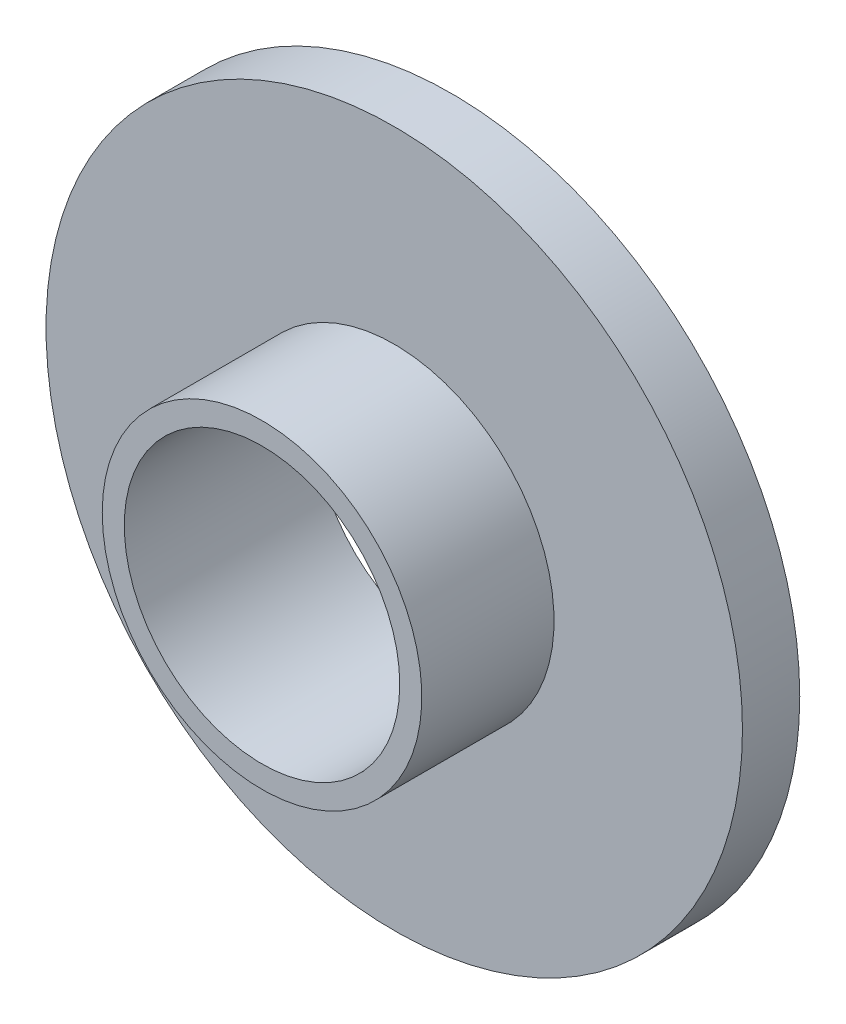
ISO-10303-21;
HEADER;
FILE_DESCRIPTION(('STEP AP214'),'2;1');
FILE_NAME('part.step','',(''),(''),'','','');
FILE_SCHEMA(('AUTOMOTIVE_DESIGN { 1 0 10303 214 1 1 1 1 }'));
ENDSEC;
DATA;
#1=APPLICATION_CONTEXT('core data for automotive mechanical design processes');
#2=APPLICATION_PROTOCOL_DEFINITION('international standard','automotive_design',2000,#1);
#3=PRODUCT_CONTEXT('',#1,'mechanical');
#4=PRODUCT('Part','Part','',(#3));
#5=PRODUCT_RELATED_PRODUCT_CATEGORY('part','',(#4));
#6=PRODUCT_DEFINITION_FORMATION('','',#4);
#7=PRODUCT_DEFINITION_CONTEXT('part definition',#1,'design');
#8=PRODUCT_DEFINITION('design','',#6,#7);
#9=PRODUCT_DEFINITION_SHAPE('','',#8);
#10=(LENGTH_UNIT() NAMED_UNIT(*) SI_UNIT(.MILLI.,.METRE.));
#11=(NAMED_UNIT(*) PLANE_ANGLE_UNIT() SI_UNIT($,.RADIAN.));
#12=(NAMED_UNIT(*) SI_UNIT($,.STERADIAN.) SOLID_ANGLE_UNIT());
#13=UNCERTAINTY_MEASURE_WITH_UNIT(LENGTH_MEASURE(1.E-05),#10,'distance_accuracy_value','');
#14=(GEOMETRIC_REPRESENTATION_CONTEXT(3) GLOBAL_UNCERTAINTY_ASSIGNED_CONTEXT((#13)) GLOBAL_UNIT_ASSIGNED_CONTEXT((#10,
#11,#12)) REPRESENTATION_CONTEXT('',''));
#15=CARTESIAN_POINT('',(0.,0.,0.));
#16=DIRECTION('',(0.,0.,1.));
#17=DIRECTION('',(1.,0.,0.));
#18=AXIS2_PLACEMENT_3D('',#15,#16,#17);
#19=CARTESIAN_POINT('',(0.,0.,1.3));
#20=DIRECTION('',(0.,0.,-1.));
#21=DIRECTION('',(-1.,0.,0.));
#22=AXIS2_PLACEMENT_3D('',#19,#20,#21);
#23=CYLINDRICAL_SURFACE('',#22,7.9);
#24=CARTESIAN_POINT('',(0.,0.,1.3));
#25=DIRECTION('',(0.,0.,1.));
#26=DIRECTION('',(1.,0.,0.));
#27=AXIS2_PLACEMENT_3D('',#24,#25,#26);
#28=CIRCLE('',#27,7.9);
#29=CARTESIAN_POINT('',(7.9,0.,1.3));
#30=VERTEX_POINT('',#29);
#31=EDGE_CURVE('E10',#30,#30,#28,.T.);
#32=ORIENTED_EDGE('',*,*,#31,.F.);
#33=EDGE_LOOP('',(#32));
#34=FACE_BOUND('',#33,.T.);
#35=CARTESIAN_POINT('',(0.,0.,0.));
#36=DIRECTION('',(0.,0.,1.));
#37=DIRECTION('',(1.,0.,0.));
#38=AXIS2_PLACEMENT_3D('',#35,#36,#37);
#39=CIRCLE('',#38,7.9);
#40=CARTESIAN_POINT('',(7.9,0.,0.));
#41=VERTEX_POINT('',#40);
#42=EDGE_CURVE('E48',#41,#41,#39,.T.);
#43=ORIENTED_EDGE('',*,*,#42,.T.);
#44=EDGE_LOOP('',(#43));
#45=FACE_BOUND('',#44,.T.);
#46=ADVANCED_FACE('F37',(#34,#45),#23,.T.);
#47=CARTESIAN_POINT('',(0.,0.,1.3));
#48=DIRECTION('',(0.,0.,-1.));
#49=DIRECTION('',(-1.,0.,0.));
#50=AXIS2_PLACEMENT_3D('',#47,#48,#49);
#51=CYLINDRICAL_SURFACE('',#50,3.125);
#52=CARTESIAN_POINT('',(0.,0.,0.));
#53=DIRECTION('',(0.,0.,1.));
#54=DIRECTION('',(1.,0.,0.));
#55=AXIS2_PLACEMENT_3D('',#52,#53,#54);
#56=CIRCLE('',#55,3.125);
#57=CARTESIAN_POINT('',(3.125,0.,0.));
#58=VERTEX_POINT('',#57);
#59=EDGE_CURVE('E40',#58,#58,#56,.T.);
#60=ORIENTED_EDGE('',*,*,#59,.F.);
#61=EDGE_LOOP('',(#60));
#62=FACE_BOUND('',#61,.T.);
#63=CARTESIAN_POINT('',(0.,0.,4.3));
#64=DIRECTION('',(0.,0.,1.));
#65=DIRECTION('',(1.,0.,0.));
#66=AXIS2_PLACEMENT_3D('',#63,#64,#65);
#67=CIRCLE('',#66,3.125);
#68=CARTESIAN_POINT('',(3.125,0.,4.3));
#69=VERTEX_POINT('',#68);
#70=EDGE_CURVE('E60',#69,#69,#67,.T.);
#71=ORIENTED_EDGE('',*,*,#70,.T.);
#72=EDGE_LOOP('',(#71));
#73=FACE_BOUND('',#72,.T.);
#74=ADVANCED_FACE('F67',(#62,#73),#51,.F.);
#75=CARTESIAN_POINT('',(0.,0.,1.3));
#76=DIRECTION('',(0.,0.,1.));
#77=DIRECTION('',(1.,0.,0.));
#78=AXIS2_PLACEMENT_3D('',#75,#76,#77);
#79=PLANE('',#78);
#80=CARTESIAN_POINT('',(0.,0.,1.3));
#81=DIRECTION('',(0.,0.,1.));
#82=DIRECTION('',(1.,0.,0.));
#83=AXIS2_PLACEMENT_3D('',#80,#81,#82);
#84=CIRCLE('',#83,3.625);
#85=CARTESIAN_POINT('',(-3.625,0.,1.3));
#86=VERTEX_POINT('',#85);
#87=EDGE_CURVE('E50',#86,#86,#84,.F.);
#88=ORIENTED_EDGE('',*,*,#87,.T.);
#89=EDGE_LOOP('',(#88));
#90=FACE_BOUND('',#89,.T.);
#91=ORIENTED_EDGE('',*,*,#31,.T.);
#92=EDGE_LOOP('',(#91));
#93=FACE_BOUND('',#92,.T.);
#94=ADVANCED_FACE('F84',(#90,#93),#79,.T.);
#95=CARTESIAN_POINT('',(0.,0.,0.));
#96=DIRECTION('',(0.,0.,1.));
#97=DIRECTION('',(1.,0.,0.));
#98=AXIS2_PLACEMENT_3D('',#95,#96,#97);
#99=PLANE('',#98);
#100=ORIENTED_EDGE('',*,*,#42,.F.);
#101=EDGE_LOOP('',(#100));
#102=FACE_BOUND('',#101,.T.);
#103=ORIENTED_EDGE('',*,*,#59,.T.);
#104=EDGE_LOOP('',(#103));
#105=FACE_BOUND('',#104,.T.);
#106=ADVANCED_FACE('F76',(#102,#105),#99,.F.);
#107=CARTESIAN_POINT('',(0.,0.,4.3));
#108=DIRECTION('',(0.,0.,-1.));
#109=DIRECTION('',(-1.,0.,0.));
#110=AXIS2_PLACEMENT_3D('',#107,#108,#109);
#111=CYLINDRICAL_SURFACE('',#110,3.625);
#112=CARTESIAN_POINT('',(0.,0.,4.3));
#113=DIRECTION('',(0.,0.,1.));
#114=DIRECTION('',(1.,0.,0.));
#115=AXIS2_PLACEMENT_3D('',#112,#113,#114);
#116=CIRCLE('',#115,3.625);
#117=CARTESIAN_POINT('',(-3.625,0.,4.3));
#118=VERTEX_POINT('',#117);
#119=EDGE_CURVE('E56',#118,#118,#116,.T.);
#120=CARTESIAN_POINT('',(-3.625,0.,1.3));
#121=CARTESIAN_POINT('',(-3.625,0.,1.33125));
#122=CARTESIAN_POINT('',(-3.625,0.,1.3625));
#123=CARTESIAN_POINT('',(-3.625,0.,1.425));
#124=CARTESIAN_POINT('',(-3.625,0.,1.45625));
#125=CARTESIAN_POINT('',(-3.625,0.,1.51875));
#126=CARTESIAN_POINT('',(-3.625,0.,1.55));
#127=CARTESIAN_POINT('',(-3.625,0.,1.6125));
#128=CARTESIAN_POINT('',(-3.625,0.,1.64375));
#129=CARTESIAN_POINT('',(-3.625,0.,1.70625));
#130=CARTESIAN_POINT('',(-3.625,0.,1.7375));
#131=CARTESIAN_POINT('',(-3.625,0.,1.8));
#132=CARTESIAN_POINT('',(-3.625,0.,1.83125));
#133=CARTESIAN_POINT('',(-3.625,0.,1.89375));
#134=CARTESIAN_POINT('',(-3.625,0.,1.925));
#135=CARTESIAN_POINT('',(-3.625,0.,1.9875));
#136=CARTESIAN_POINT('',(-3.625,0.,2.01875));
#137=CARTESIAN_POINT('',(-3.625,0.,2.08125));
#138=CARTESIAN_POINT('',(-3.625,0.,2.1125));
#139=CARTESIAN_POINT('',(-3.625,0.,2.175));
#140=CARTESIAN_POINT('',(-3.625,0.,2.20625));
#141=CARTESIAN_POINT('',(-3.625,0.,2.26875));
#142=CARTESIAN_POINT('',(-3.625,0.,2.3));
#143=CARTESIAN_POINT('',(-3.625,0.,2.3625));
#144=CARTESIAN_POINT('',(-3.625,0.,2.39375));
#145=CARTESIAN_POINT('',(-3.625,0.,2.45625));
#146=CARTESIAN_POINT('',(-3.625,0.,2.4875));
#147=CARTESIAN_POINT('',(-3.625,0.,2.55));
#148=CARTESIAN_POINT('',(-3.625,0.,2.58125));
#149=CARTESIAN_POINT('',(-3.625,0.,2.64375));
#150=CARTESIAN_POINT('',(-3.625,0.,2.675));
#151=CARTESIAN_POINT('',(-3.625,0.,2.7375));
#152=CARTESIAN_POINT('',(-3.625,0.,2.76875));
#153=CARTESIAN_POINT('',(-3.625,0.,2.83125));
#154=CARTESIAN_POINT('',(-3.625,0.,2.8625));
#155=CARTESIAN_POINT('',(-3.625,0.,2.925));
#156=CARTESIAN_POINT('',(-3.625,0.,2.95625));
#157=CARTESIAN_POINT('',(-3.625,0.,3.01875));
#158=CARTESIAN_POINT('',(-3.625,0.,3.05));
#159=CARTESIAN_POINT('',(-3.625,0.,3.1125));
#160=CARTESIAN_POINT('',(-3.625,0.,3.14375));
#161=CARTESIAN_POINT('',(-3.625,0.,3.20625));
#162=CARTESIAN_POINT('',(-3.625,0.,3.2375));
#163=CARTESIAN_POINT('',(-3.625,0.,3.3));
#164=CARTESIAN_POINT('',(-3.625,0.,3.33125));
#165=CARTESIAN_POINT('',(-3.625,0.,3.39375));
#166=CARTESIAN_POINT('',(-3.625,0.,3.425));
#167=CARTESIAN_POINT('',(-3.625,0.,3.4875));
#168=CARTESIAN_POINT('',(-3.625,0.,3.51875));
#169=CARTESIAN_POINT('',(-3.625,0.,3.58125));
#170=CARTESIAN_POINT('',(-3.625,0.,3.6125));
#171=CARTESIAN_POINT('',(-3.625,0.,3.675));
#172=CARTESIAN_POINT('',(-3.625,0.,3.70625));
#173=CARTESIAN_POINT('',(-3.625,0.,3.76875));
#174=CARTESIAN_POINT('',(-3.625,0.,3.8));
#175=CARTESIAN_POINT('',(-3.625,0.,3.8625));
#176=CARTESIAN_POINT('',(-3.625,0.,3.89375));
#177=CARTESIAN_POINT('',(-3.625,0.,3.95625));
#178=CARTESIAN_POINT('',(-3.625,0.,3.9875));
#179=CARTESIAN_POINT('',(-3.625,0.,4.05));
#180=CARTESIAN_POINT('',(-3.625,0.,4.08125));
#181=CARTESIAN_POINT('',(-3.625,0.,4.14375));
#182=CARTESIAN_POINT('',(-3.625,0.,4.175));
#183=CARTESIAN_POINT('',(-3.625,0.,4.2375));
#184=CARTESIAN_POINT('',(-3.625,0.,4.26875));
#185=CARTESIAN_POINT('',(-3.625,0.,4.3));
#186=B_SPLINE_CURVE_WITH_KNOTS('',3,(#120,#121,#122,#123,#124,#125,#126,#127,#128,#129,#130,
#131,#132,#133,#134,#135,#136,#137,#138,#139,#140,#141,#142,#143,#144,#145,#146,#147,#148,#149,
#150,#151,#152,#153,#154,#155,#156,#157,#158,#159,#160,#161,#162,#163,#164,#165,#166,#167,#168,
#169,#170,#171,#172,#173,#174,#175,#176,#177,#178,#179,#180,#181,#182,#183,#184,#185),
.UNSPECIFIED.,.F.,.F.,(4,2,2,2,2,2,2,2,2,2,2,2,2,2,2,2,2,2,2,2,2,2,2,2,2,2,2,2,2,2,2,2,4),(0.,
0.0937500000000001,0.1875,0.28125,0.375,0.46875,0.5625,0.65625,0.75,0.84375,0.9375,1.03125,
1.125,1.21875,1.3125,1.40625,1.5,1.59375,1.6875,1.78125,1.875,1.96875,2.0625,2.15625,2.25,
2.34375,2.4375,2.53125,2.625,2.71875,2.8125,2.90625,3.),.UNSPECIFIED.);
#187=EDGE_CURVE('BSEAM71',#86,#118,#186,.T.);
#188=ORIENTED_EDGE('',*,*,#87,.F.);
#189=ORIENTED_EDGE('',*,*,#119,.F.);
#190=ORIENTED_EDGE('',*,*,#187,.T.);
#191=ORIENTED_EDGE('',*,*,#187,.F.);
#192=EDGE_LOOP('',(#188,#190,#189,#191));
#193=FACE_BOUND('',#192,.T.);
#194=ADVANCED_FACE('F71',(#193),#111,.T.);
#195=CARTESIAN_POINT('',(0.,0.,4.3));
#196=DIRECTION('',(0.,0.,1.));
#197=DIRECTION('',(1.,0.,0.));
#198=AXIS2_PLACEMENT_3D('',#195,#196,#197);
#199=PLANE('',#198);
#200=ORIENTED_EDGE('',*,*,#70,.F.);
#201=EDGE_LOOP('',(#200));
#202=FACE_BOUND('',#201,.T.);
#203=ORIENTED_EDGE('',*,*,#119,.T.);
#204=EDGE_LOOP('',(#203));
#205=FACE_BOUND('',#204,.T.);
#206=ADVANCED_FACE('F69',(#202,#205),#199,.T.);
#207=CLOSED_SHELL('',(#46,#74,#94,#106,#194,#206));
#208=MANIFOLD_SOLID_BREP('B2',#207);
#209=ADVANCED_BREP_SHAPE_REPRESENTATION('',(#18,#208),#14);
#210=SHAPE_DEFINITION_REPRESENTATION(#9,#209);
ENDSEC;
END-ISO-10303-21;
